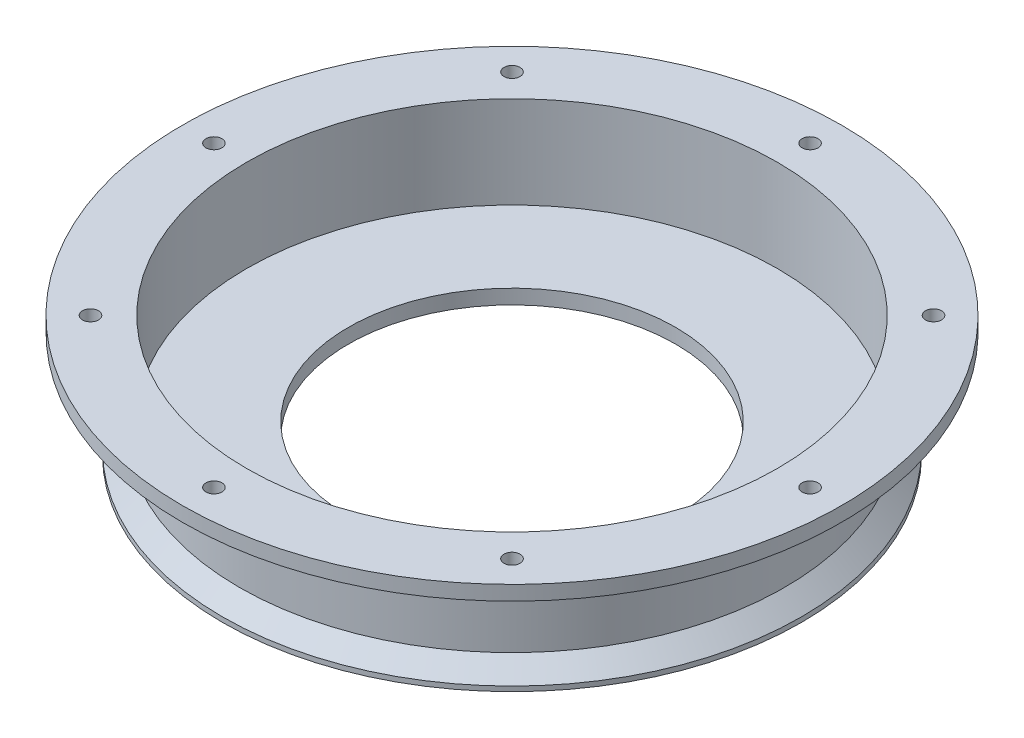
ISO-10303-21;
HEADER;
FILE_DESCRIPTION(('STEP AP214'),'2;1');
FILE_NAME('part.step','',(''),(''),'','','');
FILE_SCHEMA(('AUTOMOTIVE_DESIGN { 1 0 10303 214 1 1 1 1 }'));
ENDSEC;
DATA;
#1=APPLICATION_CONTEXT('core data for automotive mechanical design processes');
#2=APPLICATION_PROTOCOL_DEFINITION('international standard','automotive_design',2000,#1);
#3=PRODUCT_CONTEXT('',#1,'mechanical');
#4=PRODUCT('Part','Part','',(#3));
#5=PRODUCT_RELATED_PRODUCT_CATEGORY('part','',(#4));
#6=PRODUCT_DEFINITION_FORMATION('','',#4);
#7=PRODUCT_DEFINITION_CONTEXT('part definition',#1,'design');
#8=PRODUCT_DEFINITION('design','',#6,#7);
#9=PRODUCT_DEFINITION_SHAPE('','',#8);
#10=(LENGTH_UNIT() NAMED_UNIT(*) SI_UNIT(.MILLI.,.METRE.));
#11=(NAMED_UNIT(*) PLANE_ANGLE_UNIT() SI_UNIT($,.RADIAN.));
#12=(NAMED_UNIT(*) SI_UNIT($,.STERADIAN.) SOLID_ANGLE_UNIT());
#13=UNCERTAINTY_MEASURE_WITH_UNIT(LENGTH_MEASURE(1.E-05),#10,'distance_accuracy_value','');
#14=(GEOMETRIC_REPRESENTATION_CONTEXT(3) GLOBAL_UNCERTAINTY_ASSIGNED_CONTEXT((#13)) GLOBAL_UNIT_ASSIGNED_CONTEXT((#10,
#11,#12)) REPRESENTATION_CONTEXT('',''));
#15=CARTESIAN_POINT('',(0.,0.,0.));
#16=DIRECTION('',(0.,0.,1.));
#17=DIRECTION('',(1.,0.,0.));
#18=AXIS2_PLACEMENT_3D('',#15,#16,#17);
#19=CARTESIAN_POINT('',(0.,35.1783665083135,0.));
#20=DIRECTION('',(0.,1.,0.));
#21=DIRECTION('',(0.,0.,1.));
#22=AXIS2_PLACEMENT_3D('',#19,#20,#21);
#23=CYLINDRICAL_SURFACE('',#22,136.);
#24=CARTESIAN_POINT('',(0.,20.8454470738413,0.));
#25=DIRECTION('',(0.,1.,0.));
#26=DIRECTION('',(0.,0.,1.));
#27=AXIS2_PLACEMENT_3D('',#24,#25,#26);
#28=CIRCLE('',#27,136.);
#29=CARTESIAN_POINT('',(0.,20.8454470738413,136.));
#30=VERTEX_POINT('',#29);
#31=EDGE_CURVE('E10',#30,#30,#28,.T.);
#32=ORIENTED_EDGE('',*,*,#31,.T.);
#33=EDGE_LOOP('',(#32));
#34=FACE_BOUND('',#33,.T.);
#35=CARTESIAN_POINT('',(0.,26.8454470738413,0.));
#36=DIRECTION('',(0.,1.,0.));
#37=DIRECTION('',(0.,0.,1.));
#38=AXIS2_PLACEMENT_3D('',#35,#36,#37);
#39=CIRCLE('',#38,136.);
#40=CARTESIAN_POINT('',(0.,26.8454470738413,136.));
#41=VERTEX_POINT('',#40);
#42=EDGE_CURVE('E74',#41,#41,#39,.T.);
#43=ORIENTED_EDGE('',*,*,#42,.F.);
#44=EDGE_LOOP('',(#43));
#45=FACE_BOUND('',#44,.T.);
#46=ADVANCED_FACE('F34',(#34,#45),#23,.T.);
#47=CARTESIAN_POINT('',(-136.,20.8454470738413,0.));
#48=DIRECTION('',(0.,-1.,0.));
#49=DIRECTION('',(0.,0.,-1.));
#50=AXIS2_PLACEMENT_3D('',#47,#48,#49);
#51=PLANE('',#50);
#52=CARTESIAN_POINT('',(86.9741340859464,20.8454470738413,86.9741340859443));
#53=DIRECTION('',(0.,-1.,0.));
#54=DIRECTION('',(0.707106781186539,0.,-0.707106781186556));
#55=AXIS2_PLACEMENT_3D('',#52,#53,#54);
#56=CIRCLE('',#55,3.3);
#57=CARTESIAN_POINT('',(89.307586463862,20.8454470738413,84.6406817080287));
#58=VERTEX_POINT('',#57);
#59=EDGE_CURVE('E119',#58,#58,#56,.T.);
#60=ORIENTED_EDGE('',*,*,#59,.F.);
#61=EDGE_LOOP('',(#60));
#62=FACE_BOUND('',#61,.T.);
#63=CARTESIAN_POINT('',(1.28835661403312E-12,20.8454470738413,123.));
#64=DIRECTION('',(0.,-1.,0.));
#65=DIRECTION('',(1.,0.,0.));
#66=AXIS2_PLACEMENT_3D('',#63,#64,#65);
#67=CIRCLE('',#66,3.3);
#68=CARTESIAN_POINT('',(3.30000000000129,20.8454470738413,123.));
#69=VERTEX_POINT('',#68);
#70=EDGE_CURVE('E113',#69,#69,#67,.T.);
#71=ORIENTED_EDGE('',*,*,#70,.F.);
#72=EDGE_LOOP('',(#71));
#73=FACE_BOUND('',#72,.T.);
#74=CARTESIAN_POINT('',(-86.9741340859446,20.8454470738413,86.9741340859461));
#75=DIRECTION('',(0.,-1.,0.));
#76=DIRECTION('',(0.707106781186554,0.,0.707106781186541));
#77=AXIS2_PLACEMENT_3D('',#74,#75,#76);
#78=CIRCLE('',#77,3.3);
#79=CARTESIAN_POINT('',(-84.6406817080289,20.8454470738413,89.3075864638617));
#80=VERTEX_POINT('',#79);
#81=EDGE_CURVE('E107',#80,#80,#78,.T.);
#82=ORIENTED_EDGE('',*,*,#81,.F.);
#83=EDGE_LOOP('',(#82));
#84=FACE_BOUND('',#83,.T.);
#85=CARTESIAN_POINT('',(-123.,20.8454470738413,0.));
#86=DIRECTION('',(0.,-1.,0.));
#87=DIRECTION('',(0.,0.,1.));
#88=AXIS2_PLACEMENT_3D('',#85,#86,#87);
#89=CIRCLE('',#88,3.3);
#90=CARTESIAN_POINT('',(-123.,20.8454470738413,3.3));
#91=VERTEX_POINT('',#90);
#92=EDGE_CURVE('E101',#91,#91,#89,.T.);
#93=ORIENTED_EDGE('',*,*,#92,.F.);
#94=EDGE_LOOP('',(#93));
#95=FACE_BOUND('',#94,.T.);
#96=CARTESIAN_POINT('',(-86.9741340859458,20.8454470738413,-86.9741340859449));
#97=DIRECTION('',(0.,-1.,0.));
#98=DIRECTION('',(-0.707106781186544,0.,0.707106781186551));
#99=AXIS2_PLACEMENT_3D('',#96,#97,#98);
#100=CIRCLE('',#99,3.3);
#101=CARTESIAN_POINT('',(-89.3075864638614,20.8454470738413,-84.6406817080293));
#102=VERTEX_POINT('',#101);
#103=EDGE_CURVE('E95',#102,#102,#100,.T.);
#104=ORIENTED_EDGE('',*,*,#103,.F.);
#105=EDGE_LOOP('',(#104));
#106=FACE_BOUND('',#105,.T.);
#107=CARTESIAN_POINT('',(-4.29452204677705E-13,20.8454470738413,-123.));
#108=DIRECTION('',(0.,-1.,0.));
#109=DIRECTION('',(-1.,0.,0.));
#110=AXIS2_PLACEMENT_3D('',#107,#108,#109);
#111=CIRCLE('',#110,3.3);
#112=CARTESIAN_POINT('',(-3.30000000000043,20.8454470738413,-123.));
#113=VERTEX_POINT('',#112);
#114=EDGE_CURVE('E89',#113,#113,#111,.T.);
#115=ORIENTED_EDGE('',*,*,#114,.F.);
#116=EDGE_LOOP('',(#115));
#117=FACE_BOUND('',#116,.T.);
#118=CARTESIAN_POINT('',(86.9741340859452,20.8454470738413,-86.9741340859455));
#119=DIRECTION('',(0.,-1.,0.));
#120=DIRECTION('',(-0.707106781186549,0.,-0.707106781186546));
#121=AXIS2_PLACEMENT_3D('',#118,#119,#120);
#122=CIRCLE('',#121,3.3);
#123=CARTESIAN_POINT('',(84.6406817080296,20.8454470738413,-89.3075864638611));
#124=VERTEX_POINT('',#123);
#125=EDGE_CURVE('E81',#124,#124,#122,.T.);
#126=ORIENTED_EDGE('',*,*,#125,.F.);
#127=EDGE_LOOP('',(#126));
#128=FACE_BOUND('',#127,.T.);
#129=CARTESIAN_POINT('',(123.,20.8454470738413,0.));
#130=DIRECTION('',(0.,-1.,0.));
#131=DIRECTION('',(0.,0.,-1.));
#132=AXIS2_PLACEMENT_3D('',#129,#130,#131);
#133=CIRCLE('',#132,3.3);
#134=CARTESIAN_POINT('',(123.,20.8454470738413,-3.3));
#135=VERTEX_POINT('',#134);
#136=EDGE_CURVE('E78',#135,#135,#133,.T.);
#137=ORIENTED_EDGE('',*,*,#136,.F.);
#138=EDGE_LOOP('',(#137));
#139=FACE_BOUND('',#138,.T.);
#140=CARTESIAN_POINT('',(0.,20.8454470738413,0.));
#141=DIRECTION('',(0.,1.,0.));
#142=DIRECTION('',(0.,0.,1.));
#143=AXIS2_PLACEMENT_3D('',#140,#141,#142);
#144=CIRCLE('',#143,112.5);
#145=CARTESIAN_POINT('',(0.,20.8454470738413,112.5));
#146=VERTEX_POINT('',#145);
#147=EDGE_CURVE('E40',#146,#146,#144,.T.);
#148=ORIENTED_EDGE('',*,*,#147,.T.);
#149=EDGE_LOOP('',(#148));
#150=FACE_BOUND('',#149,.T.);
#151=ORIENTED_EDGE('',*,*,#31,.F.);
#152=EDGE_LOOP('',(#151));
#153=FACE_BOUND('',#152,.T.);
#154=ADVANCED_FACE('F136',(#62,#73,#84,#95,#106,#117,#128,#139,#150,#153),#51,.T.);
#155=CARTESIAN_POINT('',(0.,35.1783665083135,0.));
#156=DIRECTION('',(0.,1.,0.));
#157=DIRECTION('',(0.,0.,1.));
#158=AXIS2_PLACEMENT_3D('',#155,#156,#157);
#159=CYLINDRICAL_SURFACE('',#158,112.5);
#160=CARTESIAN_POINT('',(0.,-14.1545529261587,0.));
#161=DIRECTION('',(0.,1.,0.));
#162=DIRECTION('',(0.,0.,1.));
#163=AXIS2_PLACEMENT_3D('',#160,#161,#162);
#164=CIRCLE('',#163,112.5);
#165=CARTESIAN_POINT('',(0.,-14.1545529261587,112.5));
#166=VERTEX_POINT('',#165);
#167=EDGE_CURVE('E44',#166,#166,#164,.T.);
#168=ORIENTED_EDGE('',*,*,#167,.T.);
#169=EDGE_LOOP('',(#168));
#170=FACE_BOUND('',#169,.T.);
#171=ORIENTED_EDGE('',*,*,#147,.F.);
#172=EDGE_LOOP('',(#171));
#173=FACE_BOUND('',#172,.T.);
#174=ADVANCED_FACE('F139',(#170,#173),#159,.T.);
#175=CARTESIAN_POINT('',(0.,-14.1545529261587,0.));
#176=DIRECTION('',(0.,-1.,0.));
#177=DIRECTION('',(0.,0.,-1.));
#178=AXIS2_PLACEMENT_3D('',#175,#176,#177);
#179=CONICAL_SURFACE('',#178,112.5,0.785398163397446);
#180=CARTESIAN_POINT('',(0.,-21.1545529261587,0.));
#181=DIRECTION('',(0.,1.,0.));
#182=DIRECTION('',(0.,0.,1.));
#183=AXIS2_PLACEMENT_3D('',#180,#181,#182);
#184=CIRCLE('',#183,119.5);
#185=CARTESIAN_POINT('',(0.,-21.1545529261587,119.5));
#186=VERTEX_POINT('',#185);
#187=EDGE_CURVE('E48',#186,#186,#184,.T.);
#188=ORIENTED_EDGE('',*,*,#187,.T.);
#189=EDGE_LOOP('',(#188));
#190=FACE_BOUND('',#189,.T.);
#191=ORIENTED_EDGE('',*,*,#167,.F.);
#192=EDGE_LOOP('',(#191));
#193=FACE_BOUND('',#192,.T.);
#194=ADVANCED_FACE('F217',(#190,#193),#179,.T.);
#195=CARTESIAN_POINT('',(0.,35.1783665083135,0.));
#196=DIRECTION('',(0.,1.,0.));
#197=DIRECTION('',(0.,0.,1.));
#198=AXIS2_PLACEMENT_3D('',#195,#196,#197);
#199=CYLINDRICAL_SURFACE('',#198,119.5);
#200=CARTESIAN_POINT('',(0.,-23.1545529261587,0.));
#201=DIRECTION('',(0.,1.,0.));
#202=DIRECTION('',(0.,0.,1.));
#203=AXIS2_PLACEMENT_3D('',#200,#201,#202);
#204=CIRCLE('',#203,119.5);
#205=CARTESIAN_POINT('',(0.,-23.1545529261587,119.5));
#206=VERTEX_POINT('',#205);
#207=EDGE_CURVE('E53',#206,#206,#204,.T.);
#208=ORIENTED_EDGE('',*,*,#207,.T.);
#209=EDGE_LOOP('',(#208));
#210=FACE_BOUND('',#209,.T.);
#211=ORIENTED_EDGE('',*,*,#187,.F.);
#212=EDGE_LOOP('',(#211));
#213=FACE_BOUND('',#212,.T.);
#214=ADVANCED_FACE('F211',(#210,#213),#199,.T.);
#215=CARTESIAN_POINT('',(-119.5,-23.1545529261587,0.));
#216=DIRECTION('',(0.,-1.,0.));
#217=DIRECTION('',(0.,0.,-1.));
#218=AXIS2_PLACEMENT_3D('',#215,#216,#217);
#219=PLANE('',#218);
#220=CARTESIAN_POINT('',(0.,-23.1545529261587,0.));
#221=DIRECTION('',(0.,1.,0.));
#222=DIRECTION('',(0.,0.,1.));
#223=AXIS2_PLACEMENT_3D('',#220,#221,#222);
#224=CIRCLE('',#223,110.);
#225=CARTESIAN_POINT('',(0.,-23.1545529261587,110.));
#226=VERTEX_POINT('',#225);
#227=EDGE_CURVE('E56',#226,#226,#224,.T.);
#228=ORIENTED_EDGE('',*,*,#227,.T.);
#229=EDGE_LOOP('',(#228));
#230=FACE_BOUND('',#229,.T.);
#231=ORIENTED_EDGE('',*,*,#207,.F.);
#232=EDGE_LOOP('',(#231));
#233=FACE_BOUND('',#232,.T.);
#234=ADVANCED_FACE('F205',(#230,#233),#219,.T.);
#235=CARTESIAN_POINT('',(0.,-23.1545529261587,0.));
#236=DIRECTION('',(0.,-1.,0.));
#237=DIRECTION('',(0.,0.,-1.));
#238=AXIS2_PLACEMENT_3D('',#235,#236,#237);
#239=CONICAL_SURFACE('',#238,110.,0.785398163397447);
#240=CARTESIAN_POINT('',(0.,-17.1545529261587,0.));
#241=DIRECTION('',(0.,1.,0.));
#242=DIRECTION('',(0.,0.,1.));
#243=AXIS2_PLACEMENT_3D('',#240,#241,#242);
#244=CIRCLE('',#243,104.);
#245=CARTESIAN_POINT('',(0.,-17.1545529261587,104.));
#246=VERTEX_POINT('',#245);
#247=EDGE_CURVE('E59',#246,#246,#244,.T.);
#248=ORIENTED_EDGE('',*,*,#247,.T.);
#249=EDGE_LOOP('',(#248));
#250=FACE_BOUND('',#249,.T.);
#251=ORIENTED_EDGE('',*,*,#227,.F.);
#252=EDGE_LOOP('',(#251));
#253=FACE_BOUND('',#252,.T.);
#254=ADVANCED_FACE('F199',(#250,#253),#239,.F.);
#255=CARTESIAN_POINT('',(-104.,-17.1545529261587,0.));
#256=DIRECTION('',(0.,-1.,0.));
#257=DIRECTION('',(0.,0.,-1.));
#258=AXIS2_PLACEMENT_3D('',#255,#256,#257);
#259=PLANE('',#258);
#260=CARTESIAN_POINT('',(0.,-17.1545529261586,0.));
#261=DIRECTION('',(0.,1.,0.));
#262=DIRECTION('',(0.,0.,1.));
#263=AXIS2_PLACEMENT_3D('',#260,#261,#262);
#264=CIRCLE('',#263,67.5);
#265=CARTESIAN_POINT('',(0.,-17.1545529261586,67.5));
#266=VERTEX_POINT('',#265);
#267=EDGE_CURVE('E62',#266,#266,#264,.T.);
#268=ORIENTED_EDGE('',*,*,#267,.T.);
#269=EDGE_LOOP('',(#268));
#270=FACE_BOUND('',#269,.T.);
#271=ORIENTED_EDGE('',*,*,#247,.F.);
#272=EDGE_LOOP('',(#271));
#273=FACE_BOUND('',#272,.T.);
#274=ADVANCED_FACE('F193',(#270,#273),#259,.T.);
#275=CARTESIAN_POINT('',(0.,35.1783665083135,0.));
#276=DIRECTION('',(0.,1.,0.));
#277=DIRECTION('',(0.,0.,1.));
#278=AXIS2_PLACEMENT_3D('',#275,#276,#277);
#279=CYLINDRICAL_SURFACE('',#278,67.5);
#280=CARTESIAN_POINT('',(0.,-11.1545529261586,0.));
#281=DIRECTION('',(0.,1.,0.));
#282=DIRECTION('',(0.,0.,1.));
#283=AXIS2_PLACEMENT_3D('',#280,#281,#282);
#284=CIRCLE('',#283,67.5);
#285=CARTESIAN_POINT('',(0.,-11.1545529261586,67.5));
#286=VERTEX_POINT('',#285);
#287=EDGE_CURVE('E65',#286,#286,#284,.T.);
#288=ORIENTED_EDGE('',*,*,#287,.T.);
#289=EDGE_LOOP('',(#288));
#290=FACE_BOUND('',#289,.T.);
#291=ORIENTED_EDGE('',*,*,#267,.F.);
#292=EDGE_LOOP('',(#291));
#293=FACE_BOUND('',#292,.T.);
#294=ADVANCED_FACE('F187',(#290,#293),#279,.F.);
#295=CARTESIAN_POINT('',(-67.5,-11.1545529261587,0.));
#296=DIRECTION('',(0.,1.,0.));
#297=DIRECTION('',(0.,0.,1.));
#298=AXIS2_PLACEMENT_3D('',#295,#296,#297);
#299=PLANE('',#298);
#300=CARTESIAN_POINT('',(0.,-11.1545529261587,0.));
#301=DIRECTION('',(0.,1.,0.));
#302=DIRECTION('',(0.,0.,1.));
#303=AXIS2_PLACEMENT_3D('',#300,#301,#302);
#304=CIRCLE('',#303,109.5);
#305=CARTESIAN_POINT('',(0.,-11.1545529261587,109.5));
#306=VERTEX_POINT('',#305);
#307=EDGE_CURVE('E68',#306,#306,#304,.T.);
#308=ORIENTED_EDGE('',*,*,#307,.T.);
#309=EDGE_LOOP('',(#308));
#310=FACE_BOUND('',#309,.T.);
#311=ORIENTED_EDGE('',*,*,#287,.F.);
#312=EDGE_LOOP('',(#311));
#313=FACE_BOUND('',#312,.T.);
#314=ADVANCED_FACE('F181',(#310,#313),#299,.T.);
#315=CARTESIAN_POINT('',(0.,35.1783665083135,0.));
#316=DIRECTION('',(0.,1.,0.));
#317=DIRECTION('',(0.,0.,1.));
#318=AXIS2_PLACEMENT_3D('',#315,#316,#317);
#319=CYLINDRICAL_SURFACE('',#318,109.5);
#320=CARTESIAN_POINT('',(0.,26.8454470738413,0.));
#321=DIRECTION('',(0.,1.,0.));
#322=DIRECTION('',(0.,0.,1.));
#323=AXIS2_PLACEMENT_3D('',#320,#321,#322);
#324=CIRCLE('',#323,109.5);
#325=CARTESIAN_POINT('',(0.,26.8454470738413,109.5));
#326=VERTEX_POINT('',#325);
#327=EDGE_CURVE('E71',#326,#326,#324,.T.);
#328=ORIENTED_EDGE('',*,*,#327,.T.);
#329=EDGE_LOOP('',(#328));
#330=FACE_BOUND('',#329,.T.);
#331=ORIENTED_EDGE('',*,*,#307,.F.);
#332=EDGE_LOOP('',(#331));
#333=FACE_BOUND('',#332,.T.);
#334=ADVANCED_FACE('F167',(#330,#333),#319,.F.);
#335=CARTESIAN_POINT('',(-109.5,26.8454470738413,0.));
#336=DIRECTION('',(0.,1.,0.));
#337=DIRECTION('',(0.,0.,1.));
#338=AXIS2_PLACEMENT_3D('',#335,#336,#337);
#339=PLANE('',#338);
#340=CARTESIAN_POINT('',(86.9741340859464,26.8454470738413,86.9741340859443));
#341=DIRECTION('',(0.,-1.,0.));
#342=DIRECTION('',(0.707106781186539,0.,-0.707106781186556));
#343=AXIS2_PLACEMENT_3D('',#340,#341,#342);
#344=CIRCLE('',#343,3.3);
#345=CARTESIAN_POINT('',(89.307586463862,26.8454470738413,84.6406817080287));
#346=VERTEX_POINT('',#345);
#347=EDGE_CURVE('E122',#346,#346,#344,.T.);
#348=ORIENTED_EDGE('',*,*,#347,.T.);
#349=EDGE_LOOP('',(#348));
#350=FACE_BOUND('',#349,.T.);
#351=CARTESIAN_POINT('',(1.28835661403312E-12,26.8454470738413,123.));
#352=DIRECTION('',(0.,-1.,0.));
#353=DIRECTION('',(1.,0.,0.));
#354=AXIS2_PLACEMENT_3D('',#351,#352,#353);
#355=CIRCLE('',#354,3.3);
#356=CARTESIAN_POINT('',(3.30000000000129,26.8454470738413,123.));
#357=VERTEX_POINT('',#356);
#358=EDGE_CURVE('E116',#357,#357,#355,.T.);
#359=ORIENTED_EDGE('',*,*,#358,.T.);
#360=EDGE_LOOP('',(#359));
#361=FACE_BOUND('',#360,.T.);
#362=CARTESIAN_POINT('',(-86.9741340859446,26.8454470738413,86.9741340859461));
#363=DIRECTION('',(0.,-1.,0.));
#364=DIRECTION('',(0.707106781186554,0.,0.707106781186541));
#365=AXIS2_PLACEMENT_3D('',#362,#363,#364);
#366=CIRCLE('',#365,3.3);
#367=CARTESIAN_POINT('',(-84.6406817080289,26.8454470738413,89.3075864638617));
#368=VERTEX_POINT('',#367);
#369=EDGE_CURVE('E110',#368,#368,#366,.T.);
#370=ORIENTED_EDGE('',*,*,#369,.T.);
#371=EDGE_LOOP('',(#370));
#372=FACE_BOUND('',#371,.T.);
#373=CARTESIAN_POINT('',(-123.,26.8454470738413,0.));
#374=DIRECTION('',(0.,-1.,0.));
#375=DIRECTION('',(0.,0.,1.));
#376=AXIS2_PLACEMENT_3D('',#373,#374,#375);
#377=CIRCLE('',#376,3.3);
#378=CARTESIAN_POINT('',(-123.,26.8454470738413,3.3));
#379=VERTEX_POINT('',#378);
#380=EDGE_CURVE('E104',#379,#379,#377,.T.);
#381=ORIENTED_EDGE('',*,*,#380,.T.);
#382=EDGE_LOOP('',(#381));
#383=FACE_BOUND('',#382,.T.);
#384=CARTESIAN_POINT('',(-86.9741340859458,26.8454470738413,-86.9741340859449));
#385=DIRECTION('',(0.,-1.,0.));
#386=DIRECTION('',(-0.707106781186544,0.,0.707106781186551));
#387=AXIS2_PLACEMENT_3D('',#384,#385,#386);
#388=CIRCLE('',#387,3.3);
#389=CARTESIAN_POINT('',(-89.3075864638614,26.8454470738413,-84.6406817080293));
#390=VERTEX_POINT('',#389);
#391=EDGE_CURVE('E98',#390,#390,#388,.T.);
#392=ORIENTED_EDGE('',*,*,#391,.T.);
#393=EDGE_LOOP('',(#392));
#394=FACE_BOUND('',#393,.T.);
#395=CARTESIAN_POINT('',(-4.29452204677705E-13,26.8454470738413,-123.));
#396=DIRECTION('',(0.,-1.,0.));
#397=DIRECTION('',(-1.,0.,0.));
#398=AXIS2_PLACEMENT_3D('',#395,#396,#397);
#399=CIRCLE('',#398,3.3);
#400=CARTESIAN_POINT('',(-3.30000000000043,26.8454470738413,-123.));
#401=VERTEX_POINT('',#400);
#402=EDGE_CURVE('E92',#401,#401,#399,.T.);
#403=ORIENTED_EDGE('',*,*,#402,.T.);
#404=EDGE_LOOP('',(#403));
#405=FACE_BOUND('',#404,.T.);
#406=CARTESIAN_POINT('',(86.9741340859452,26.8454470738413,-86.9741340859455));
#407=DIRECTION('',(0.,-1.,0.));
#408=DIRECTION('',(-0.707106781186549,0.,-0.707106781186546));
#409=AXIS2_PLACEMENT_3D('',#406,#407,#408);
#410=CIRCLE('',#409,3.3);
#411=CARTESIAN_POINT('',(84.6406817080296,26.8454470738413,-89.3075864638611));
#412=VERTEX_POINT('',#411);
#413=EDGE_CURVE('E86',#412,#412,#410,.T.);
#414=ORIENTED_EDGE('',*,*,#413,.T.);
#415=EDGE_LOOP('',(#414));
#416=FACE_BOUND('',#415,.T.);
#417=CARTESIAN_POINT('',(123.,26.8454470738413,0.));
#418=DIRECTION('',(0.,-1.,0.));
#419=DIRECTION('',(0.,0.,-1.));
#420=AXIS2_PLACEMENT_3D('',#417,#418,#419);
#421=CIRCLE('',#420,3.3);
#422=CARTESIAN_POINT('',(123.,26.8454470738413,-3.3));
#423=VERTEX_POINT('',#422);
#424=EDGE_CURVE('E77',#423,#423,#421,.T.);
#425=ORIENTED_EDGE('',*,*,#424,.T.);
#426=EDGE_LOOP('',(#425));
#427=FACE_BOUND('',#426,.T.);
#428=ORIENTED_EDGE('',*,*,#42,.T.);
#429=EDGE_LOOP('',(#428));
#430=FACE_BOUND('',#429,.T.);
#431=ORIENTED_EDGE('',*,*,#327,.F.);
#432=EDGE_LOOP('',(#431));
#433=FACE_BOUND('',#432,.T.);
#434=ADVANCED_FACE('F126',(#350,#361,#372,#383,#394,#405,#416,#427,#430,#433),#339,.T.);
#435=CARTESIAN_POINT('',(123.,26.8454470738413,0.));
#436=DIRECTION('',(0.,-1.,0.));
#437=DIRECTION('',(0.,0.,-1.));
#438=AXIS2_PLACEMENT_3D('',#435,#436,#437);
#439=CYLINDRICAL_SURFACE('',#438,3.3);
#440=ORIENTED_EDGE('',*,*,#424,.F.);
#441=EDGE_LOOP('',(#440));
#442=FACE_BOUND('',#441,.T.);
#443=ORIENTED_EDGE('',*,*,#136,.T.);
#444=EDGE_LOOP('',(#443));
#445=FACE_BOUND('',#444,.T.);
#446=ADVANCED_FACE('F155',(#442,#445),#439,.F.);
#447=CARTESIAN_POINT('',(86.9741340859452,26.8454470738413,-86.9741340859455));
#448=DIRECTION('',(0.,-1.,0.));
#449=DIRECTION('',(-0.707106781186549,0.,-0.707106781186546));
#450=AXIS2_PLACEMENT_3D('',#447,#448,#449);
#451=CYLINDRICAL_SURFACE('',#450,3.3);
#452=ORIENTED_EDGE('',*,*,#413,.F.);
#453=EDGE_LOOP('',(#452));
#454=FACE_BOUND('',#453,.T.);
#455=ORIENTED_EDGE('',*,*,#125,.T.);
#456=EDGE_LOOP('',(#455));
#457=FACE_BOUND('',#456,.T.);
#458=ADVANCED_FACE('F157',(#454,#457),#451,.F.);
#459=CARTESIAN_POINT('',(-4.29452204677705E-13,26.8454470738413,-123.));
#460=DIRECTION('',(0.,-1.,0.));
#461=DIRECTION('',(-1.,0.,0.));
#462=AXIS2_PLACEMENT_3D('',#459,#460,#461);
#463=CYLINDRICAL_SURFACE('',#462,3.3);
#464=ORIENTED_EDGE('',*,*,#402,.F.);
#465=EDGE_LOOP('',(#464));
#466=FACE_BOUND('',#465,.T.);
#467=ORIENTED_EDGE('',*,*,#114,.T.);
#468=EDGE_LOOP('',(#467));
#469=FACE_BOUND('',#468,.T.);
#470=ADVANCED_FACE('F164',(#466,#469),#463,.F.);
#471=CARTESIAN_POINT('',(-86.9741340859458,26.8454470738413,-86.9741340859449));
#472=DIRECTION('',(0.,-1.,0.));
#473=DIRECTION('',(-0.707106781186544,0.,0.707106781186551));
#474=AXIS2_PLACEMENT_3D('',#471,#472,#473);
#475=CYLINDRICAL_SURFACE('',#474,3.3);
#476=ORIENTED_EDGE('',*,*,#391,.F.);
#477=EDGE_LOOP('',(#476));
#478=FACE_BOUND('',#477,.T.);
#479=ORIENTED_EDGE('',*,*,#103,.T.);
#480=EDGE_LOOP('',(#479));
#481=FACE_BOUND('',#480,.T.);
#482=ADVANCED_FACE('F287',(#478,#481),#475,.F.);
#483=CARTESIAN_POINT('',(-123.,26.8454470738413,0.));
#484=DIRECTION('',(0.,-1.,0.));
#485=DIRECTION('',(0.,0.,1.));
#486=AXIS2_PLACEMENT_3D('',#483,#484,#485);
#487=CYLINDRICAL_SURFACE('',#486,3.3);
#488=ORIENTED_EDGE('',*,*,#380,.F.);
#489=EDGE_LOOP('',(#488));
#490=FACE_BOUND('',#489,.T.);
#491=ORIENTED_EDGE('',*,*,#92,.T.);
#492=EDGE_LOOP('',(#491));
#493=FACE_BOUND('',#492,.T.);
#494=ADVANCED_FACE('F297',(#490,#493),#487,.F.);
#495=CARTESIAN_POINT('',(-86.9741340859446,26.8454470738413,86.9741340859461));
#496=DIRECTION('',(0.,-1.,0.));
#497=DIRECTION('',(0.707106781186554,0.,0.707106781186541));
#498=AXIS2_PLACEMENT_3D('',#495,#496,#497);
#499=CYLINDRICAL_SURFACE('',#498,3.3);
#500=ORIENTED_EDGE('',*,*,#369,.F.);
#501=EDGE_LOOP('',(#500));
#502=FACE_BOUND('',#501,.T.);
#503=ORIENTED_EDGE('',*,*,#81,.T.);
#504=EDGE_LOOP('',(#503));
#505=FACE_BOUND('',#504,.T.);
#506=ADVANCED_FACE('F307',(#502,#505),#499,.F.);
#507=CARTESIAN_POINT('',(1.28835661403312E-12,26.8454470738413,123.));
#508=DIRECTION('',(0.,-1.,0.));
#509=DIRECTION('',(1.,0.,0.));
#510=AXIS2_PLACEMENT_3D('',#507,#508,#509);
#511=CYLINDRICAL_SURFACE('',#510,3.3);
#512=ORIENTED_EDGE('',*,*,#358,.F.);
#513=EDGE_LOOP('',(#512));
#514=FACE_BOUND('',#513,.T.);
#515=ORIENTED_EDGE('',*,*,#70,.T.);
#516=EDGE_LOOP('',(#515));
#517=FACE_BOUND('',#516,.T.);
#518=ADVANCED_FACE('F132',(#514,#517),#511,.F.);
#519=CARTESIAN_POINT('',(86.9741340859464,26.8454470738413,86.9741340859443));
#520=DIRECTION('',(0.,-1.,0.));
#521=DIRECTION('',(0.707106781186539,0.,-0.707106781186556));
#522=AXIS2_PLACEMENT_3D('',#519,#520,#521);
#523=CYLINDRICAL_SURFACE('',#522,3.3);
#524=ORIENTED_EDGE('',*,*,#347,.F.);
#525=EDGE_LOOP('',(#524));
#526=FACE_BOUND('',#525,.T.);
#527=ORIENTED_EDGE('',*,*,#59,.T.);
#528=EDGE_LOOP('',(#527));
#529=FACE_BOUND('',#528,.T.);
#530=ADVANCED_FACE('F129',(#526,#529),#523,.F.);
#531=CLOSED_SHELL('',(#46,#154,#174,#194,#214,#234,#254,#274,#294,#314,#334,#434,#446,#458,#470,
#482,#494,#506,#518,#530));
#532=MANIFOLD_SOLID_BREP('B2',#531);
#533=ADVANCED_BREP_SHAPE_REPRESENTATION('',(#18,#532),#14);
#534=SHAPE_DEFINITION_REPRESENTATION(#9,#533);
ENDSEC;
END-ISO-10303-21;
